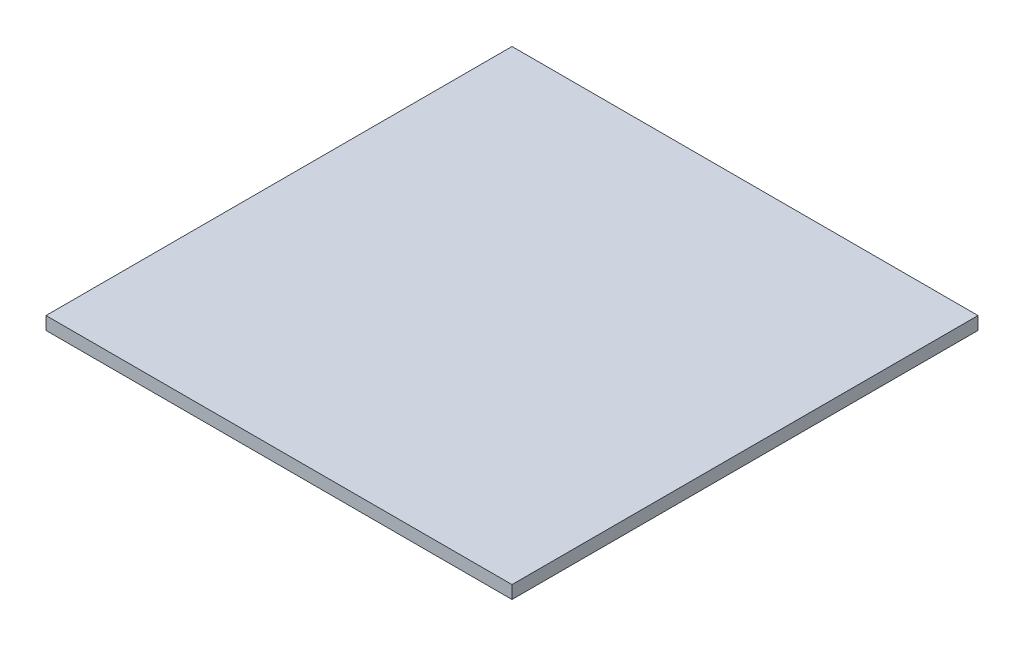
ISO-10303-21;
HEADER;
FILE_DESCRIPTION(('STEP AP214'),'2;1');
FILE_NAME('part.step','',(''),(''),'','','');
FILE_SCHEMA(('AUTOMOTIVE_DESIGN { 1 0 10303 214 1 1 1 1 }'));
ENDSEC;
DATA;
#1=APPLICATION_CONTEXT('core data for automotive mechanical design processes');
#2=APPLICATION_PROTOCOL_DEFINITION('international standard','automotive_design',2000,#1);
#3=PRODUCT_CONTEXT('',#1,'mechanical');
#4=PRODUCT('Part','Part','',(#3));
#5=PRODUCT_RELATED_PRODUCT_CATEGORY('part','',(#4));
#6=PRODUCT_DEFINITION_FORMATION('','',#4);
#7=PRODUCT_DEFINITION_CONTEXT('part definition',#1,'design');
#8=PRODUCT_DEFINITION('design','',#6,#7);
#9=PRODUCT_DEFINITION_SHAPE('','',#8);
#10=(LENGTH_UNIT() NAMED_UNIT(*) SI_UNIT(.MILLI.,.METRE.));
#11=(NAMED_UNIT(*) PLANE_ANGLE_UNIT() SI_UNIT($,.RADIAN.));
#12=(NAMED_UNIT(*) SI_UNIT($,.STERADIAN.) SOLID_ANGLE_UNIT());
#13=UNCERTAINTY_MEASURE_WITH_UNIT(LENGTH_MEASURE(1.E-05),#10,'distance_accuracy_value','');
#14=(GEOMETRIC_REPRESENTATION_CONTEXT(3) GLOBAL_UNCERTAINTY_ASSIGNED_CONTEXT((#13)) GLOBAL_UNIT_ASSIGNED_CONTEXT((#10,
#11,#12)) REPRESENTATION_CONTEXT('',''));
#15=CARTESIAN_POINT('',(0.,0.,0.));
#16=DIRECTION('',(0.,0.,1.));
#17=DIRECTION('',(1.,0.,0.));
#18=AXIS2_PLACEMENT_3D('',#15,#16,#17);
#19=CARTESIAN_POINT('',(0.,12.7,0.));
#20=DIRECTION('',(1.,0.,0.));
#21=DIRECTION('',(0.,0.,-1.));
#22=AXIS2_PLACEMENT_3D('',#19,#20,#21);
#23=PLANE('',#22);
#24=DIRECTION('',(0.,0.,1.));
#25=VECTOR('',#24,1.);
#26=CARTESIAN_POINT('',(0.,0.,0.));
#27=LINE('',#26,#25);
#28=CARTESIAN_POINT('',(0.,0.,-457.2));
#29=VERTEX_POINT('',#28);
#30=CARTESIAN_POINT('',(0.,0.,0.));
#31=VERTEX_POINT('',#30);
#32=EDGE_CURVE('E107',#29,#31,#27,.T.);
#33=ORIENTED_EDGE('',*,*,#32,.T.);
#34=DIRECTION('',(0.,-1.,0.));
#35=VECTOR('',#34,1.);
#36=CARTESIAN_POINT('',(0.,12.7,0.));
#37=LINE('',#36,#35);
#38=CARTESIAN_POINT('',(0.,12.7,0.));
#39=VERTEX_POINT('',#38);
#40=EDGE_CURVE('E11',#39,#31,#37,.T.);
#41=ORIENTED_EDGE('',*,*,#40,.F.);
#42=DIRECTION('',(0.,0.,1.));
#43=VECTOR('',#42,1.);
#44=CARTESIAN_POINT('',(0.,12.7,0.));
#45=LINE('',#44,#43);
#46=CARTESIAN_POINT('',(0.,12.7,-457.2));
#47=VERTEX_POINT('',#46);
#48=EDGE_CURVE('E91',#47,#39,#45,.T.);
#49=ORIENTED_EDGE('',*,*,#48,.F.);
#50=DIRECTION('',(0.,-1.,0.));
#51=VECTOR('',#50,1.);
#52=CARTESIAN_POINT('',(0.,12.7,-457.2));
#53=LINE('',#52,#51);
#54=EDGE_CURVE('E103',#47,#29,#53,.T.);
#55=ORIENTED_EDGE('',*,*,#54,.T.);
#56=EDGE_LOOP('',(#33,#41,#49,#55));
#57=FACE_BOUND('',#56,.T.);
#58=ADVANCED_FACE('F39',(#57),#23,.F.);
#59=CARTESIAN_POINT('',(0.,12.7,0.));
#60=DIRECTION('',(0.,0.,-1.));
#61=DIRECTION('',(-1.,0.,0.));
#62=AXIS2_PLACEMENT_3D('',#59,#60,#61);
#63=PLANE('',#62);
#64=DIRECTION('',(1.,0.,0.));
#65=VECTOR('',#64,1.);
#66=CARTESIAN_POINT('',(0.,0.,0.));
#67=LINE('',#66,#65);
#68=CARTESIAN_POINT('',(457.2,0.,0.));
#69=VERTEX_POINT('',#68);
#70=EDGE_CURVE('E96',#31,#69,#67,.T.);
#71=ORIENTED_EDGE('',*,*,#70,.T.);
#72=DIRECTION('',(0.,-1.,0.));
#73=VECTOR('',#72,1.);
#74=CARTESIAN_POINT('',(457.2,12.7,0.));
#75=LINE('',#74,#73);
#76=CARTESIAN_POINT('',(457.2,12.7,0.));
#77=VERTEX_POINT('',#76);
#78=EDGE_CURVE('E48',#77,#69,#75,.T.);
#79=ORIENTED_EDGE('',*,*,#78,.F.);
#80=DIRECTION('',(1.,0.,0.));
#81=VECTOR('',#80,1.);
#82=CARTESIAN_POINT('',(0.,12.7,0.));
#83=LINE('',#82,#81);
#84=EDGE_CURVE('E86',#39,#77,#83,.T.);
#85=ORIENTED_EDGE('',*,*,#84,.F.);
#86=ORIENTED_EDGE('',*,*,#40,.T.);
#87=EDGE_LOOP('',(#71,#79,#85,#86));
#88=FACE_BOUND('',#87,.T.);
#89=ADVANCED_FACE('F95',(#88),#63,.F.);
#90=CARTESIAN_POINT('',(457.2,12.7,0.));
#91=DIRECTION('',(-1.,0.,0.));
#92=DIRECTION('',(0.,0.,1.));
#93=AXIS2_PLACEMENT_3D('',#90,#91,#92);
#94=PLANE('',#93);
#95=DIRECTION('',(0.,0.,-1.));
#96=VECTOR('',#95,1.);
#97=CARTESIAN_POINT('',(457.2,0.,0.));
#98=LINE('',#97,#96);
#99=CARTESIAN_POINT('',(457.2,0.,-457.2));
#100=VERTEX_POINT('',#99);
#101=EDGE_CURVE('E73',#69,#100,#98,.T.);
#102=ORIENTED_EDGE('',*,*,#101,.T.);
#103=DIRECTION('',(0.,-1.,0.));
#104=VECTOR('',#103,1.);
#105=CARTESIAN_POINT('',(457.2,12.7,-457.2));
#106=LINE('',#105,#104);
#107=CARTESIAN_POINT('',(457.2,12.7,-457.2));
#108=VERTEX_POINT('',#107);
#109=EDGE_CURVE('E98',#108,#100,#106,.T.);
#110=ORIENTED_EDGE('',*,*,#109,.F.);
#111=DIRECTION('',(0.,0.,-1.));
#112=VECTOR('',#111,1.);
#113=CARTESIAN_POINT('',(457.2,12.7,0.));
#114=LINE('',#113,#112);
#115=EDGE_CURVE('E89',#77,#108,#114,.T.);
#116=ORIENTED_EDGE('',*,*,#115,.F.);
#117=ORIENTED_EDGE('',*,*,#78,.T.);
#118=EDGE_LOOP('',(#102,#110,#116,#117));
#119=FACE_BOUND('',#118,.T.);
#120=ADVANCED_FACE('F99',(#119),#94,.F.);
#121=CARTESIAN_POINT('',(0.,12.7,-457.2));
#122=DIRECTION('',(0.,0.,1.));
#123=DIRECTION('',(1.,0.,0.));
#124=AXIS2_PLACEMENT_3D('',#121,#122,#123);
#125=PLANE('',#124);
#126=DIRECTION('',(-1.,0.,0.));
#127=VECTOR('',#126,1.);
#128=CARTESIAN_POINT('',(0.,0.,-457.2));
#129=LINE('',#128,#127);
#130=EDGE_CURVE('E79',#100,#29,#129,.T.);
#131=ORIENTED_EDGE('',*,*,#130,.T.);
#132=ORIENTED_EDGE('',*,*,#54,.F.);
#133=DIRECTION('',(-1.,0.,0.));
#134=VECTOR('',#133,1.);
#135=CARTESIAN_POINT('',(0.,12.7,-457.2));
#136=LINE('',#135,#134);
#137=EDGE_CURVE('E56',#108,#47,#136,.T.);
#138=ORIENTED_EDGE('',*,*,#137,.F.);
#139=ORIENTED_EDGE('',*,*,#109,.T.);
#140=EDGE_LOOP('',(#131,#132,#138,#139));
#141=FACE_BOUND('',#140,.T.);
#142=ADVANCED_FACE('F120',(#141),#125,.F.);
#143=CARTESIAN_POINT('',(0.,12.7,0.));
#144=DIRECTION('',(0.,-1.,0.));
#145=DIRECTION('',(0.,0.,-1.));
#146=AXIS2_PLACEMENT_3D('',#143,#144,#145);
#147=PLANE('',#146);
#148=ORIENTED_EDGE('',*,*,#48,.T.);
#149=ORIENTED_EDGE('',*,*,#84,.T.);
#150=ORIENTED_EDGE('',*,*,#115,.T.);
#151=ORIENTED_EDGE('',*,*,#137,.T.);
#152=EDGE_LOOP('',(#148,#149,#150,#151));
#153=FACE_BOUND('',#152,.T.);
#154=ADVANCED_FACE('F87',(#153),#147,.F.);
#155=CARTESIAN_POINT('',(0.,0.,0.));
#156=DIRECTION('',(0.,-1.,0.));
#157=DIRECTION('',(0.,0.,-1.));
#158=AXIS2_PLACEMENT_3D('',#155,#156,#157);
#159=PLANE('',#158);
#160=ORIENTED_EDGE('',*,*,#32,.F.);
#161=ORIENTED_EDGE('',*,*,#130,.F.);
#162=ORIENTED_EDGE('',*,*,#101,.F.);
#163=ORIENTED_EDGE('',*,*,#70,.F.);
#164=EDGE_LOOP('',(#160,#161,#162,#163));
#165=FACE_BOUND('',#164,.T.);
#166=ADVANCED_FACE('F123',(#165),#159,.T.);
#167=CLOSED_SHELL('',(#58,#89,#120,#142,#154,#166));
#168=MANIFOLD_SOLID_BREP('B2',#167);
#169=ADVANCED_BREP_SHAPE_REPRESENTATION('',(#18,#168),#14);
#170=SHAPE_DEFINITION_REPRESENTATION(#9,#169);
ENDSEC;
END-ISO-10303-21;
